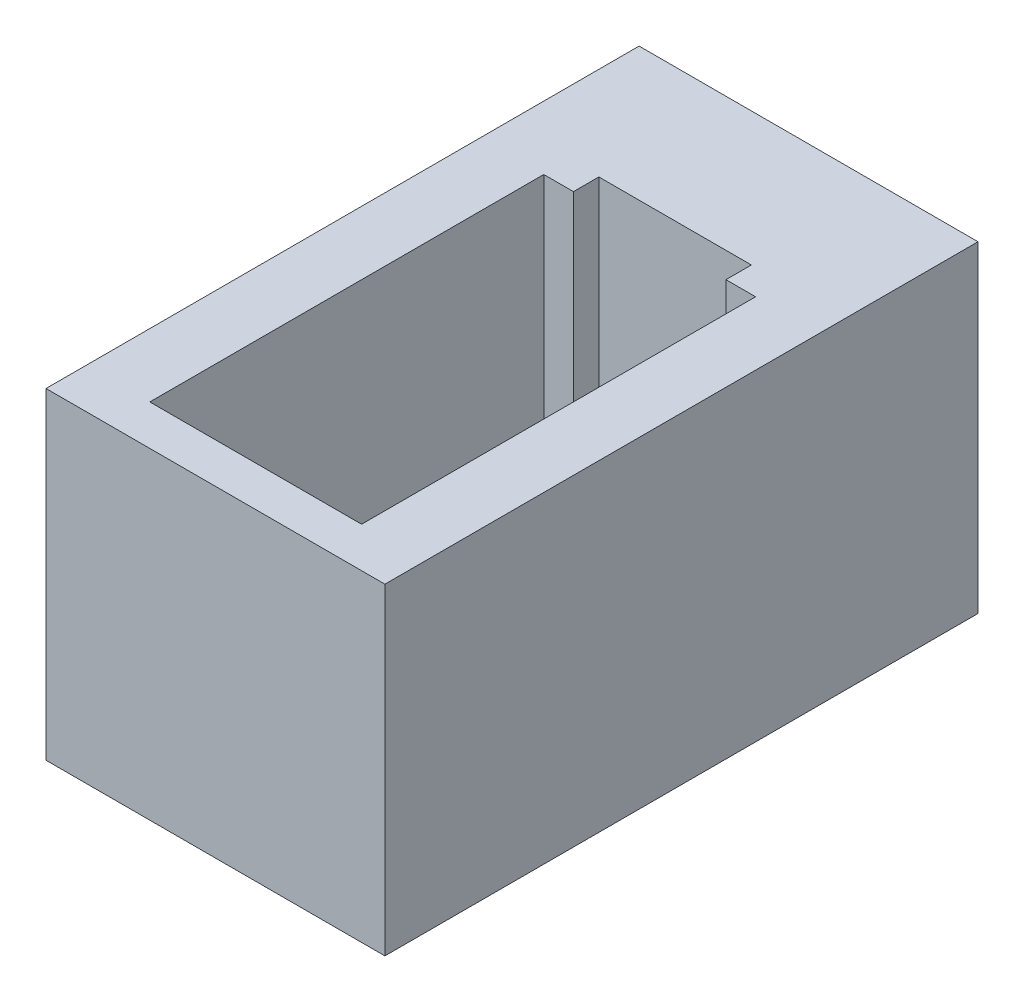
ISO-10303-21;
HEADER;
FILE_DESCRIPTION(('STEP AP214'),'2;1');
FILE_NAME('part.step','',(''),(''),'','','');
FILE_SCHEMA(('AUTOMOTIVE_DESIGN { 1 0 10303 214 1 1 1 1 }'));
ENDSEC;
DATA;
#1=APPLICATION_CONTEXT('core data for automotive mechanical design processes');
#2=APPLICATION_PROTOCOL_DEFINITION('international standard','automotive_design',2000,#1);
#3=PRODUCT_CONTEXT('',#1,'mechanical');
#4=PRODUCT('Part','Part','',(#3));
#5=PRODUCT_RELATED_PRODUCT_CATEGORY('part','',(#4));
#6=PRODUCT_DEFINITION_FORMATION('','',#4);
#7=PRODUCT_DEFINITION_CONTEXT('part definition',#1,'design');
#8=PRODUCT_DEFINITION('design','',#6,#7);
#9=PRODUCT_DEFINITION_SHAPE('','',#8);
#10=(LENGTH_UNIT() NAMED_UNIT(*) SI_UNIT(.MILLI.,.METRE.));
#11=(NAMED_UNIT(*) PLANE_ANGLE_UNIT() SI_UNIT($,.RADIAN.));
#12=(NAMED_UNIT(*) SI_UNIT($,.STERADIAN.) SOLID_ANGLE_UNIT());
#13=UNCERTAINTY_MEASURE_WITH_UNIT(LENGTH_MEASURE(1.E-05),#10,'distance_accuracy_value','');
#14=(GEOMETRIC_REPRESENTATION_CONTEXT(3) GLOBAL_UNCERTAINTY_ASSIGNED_CONTEXT((#13)) GLOBAL_UNIT_ASSIGNED_CONTEXT((#10,
#11,#12)) REPRESENTATION_CONTEXT('',''));
#15=CARTESIAN_POINT('',(0.,0.,0.));
#16=DIRECTION('',(0.,0.,1.));
#17=DIRECTION('',(1.,0.,0.));
#18=AXIS2_PLACEMENT_3D('',#15,#16,#17);
#19=CARTESIAN_POINT('',(-6.25,3.,-11.625));
#20=DIRECTION('',(0.,0.,-1.));
#21=DIRECTION('',(-1.,0.,0.));
#22=AXIS2_PLACEMENT_3D('',#19,#20,#21);
#23=PLANE('',#22);
#24=DIRECTION('',(-1.,0.,0.));
#25=VECTOR('',#24,1.);
#26=CARTESIAN_POINT('',(-6.25,19.,-11.625));
#27=LINE('',#26,#25);
#28=CARTESIAN_POINT('',(6.25,19.,-11.625));
#29=VERTEX_POINT('',#28);
#30=CARTESIAN_POINT('',(4.5,19.,-11.625));
#31=VERTEX_POINT('',#30);
#32=EDGE_CURVE('E206',#29,#31,#27,.T.);
#33=ORIENTED_EDGE('',*,*,#32,.T.);
#34=DIRECTION('',(0.,-1.,0.));
#35=VECTOR('',#34,1.);
#36=CARTESIAN_POINT('',(4.5,3.,-11.625));
#37=LINE('',#36,#35);
#38=CARTESIAN_POINT('',(4.5,3.,-11.625));
#39=VERTEX_POINT('',#38);
#40=EDGE_CURVE('E174',#31,#39,#37,.T.);
#41=ORIENTED_EDGE('',*,*,#40,.T.);
#42=DIRECTION('',(-1.,0.,0.));
#43=VECTOR('',#42,1.);
#44=CARTESIAN_POINT('',(-6.25,3.,-11.625));
#45=LINE('',#44,#43);
#46=CARTESIAN_POINT('',(6.25,3.,-11.625));
#47=VERTEX_POINT('',#46);
#48=EDGE_CURVE('E195',#47,#39,#45,.T.);
#49=ORIENTED_EDGE('',*,*,#48,.F.);
#50=DIRECTION('',(0.,1.,0.));
#51=VECTOR('',#50,1.);
#52=CARTESIAN_POINT('',(6.25,3.,-11.625));
#53=LINE('',#52,#51);
#54=EDGE_CURVE('E204',#47,#29,#53,.T.);
#55=ORIENTED_EDGE('',*,*,#54,.T.);
#56=EDGE_LOOP('',(#33,#41,#49,#55));
#57=FACE_BOUND('',#56,.T.);
#58=ADVANCED_FACE('F33',(#57),#23,.F.);
#59=CARTESIAN_POINT('',(10.,19.,-14.));
#60=DIRECTION('',(-1.,0.,0.));
#61=DIRECTION('',(0.,0.,1.));
#62=AXIS2_PLACEMENT_3D('',#59,#60,#61);
#63=PLANE('',#62);
#64=DIRECTION('',(0.,0.,-1.));
#65=VECTOR('',#64,1.);
#66=CARTESIAN_POINT('',(10.,0.,-14.));
#67=LINE('',#66,#65);
#68=CARTESIAN_POINT('',(10.,0.,14.));
#69=VERTEX_POINT('',#68);
#70=CARTESIAN_POINT('',(9.99999999999999,0.,-21.));
#71=VERTEX_POINT('',#70);
#72=EDGE_CURVE('E216',#69,#71,#67,.T.);
#73=ORIENTED_EDGE('',*,*,#72,.T.);
#74=DIRECTION('',(0.,-1.,0.));
#75=VECTOR('',#74,1.);
#76=CARTESIAN_POINT('',(9.99999999999999,19.,-21.));
#77=LINE('',#76,#75);
#78=CARTESIAN_POINT('',(9.99999999999999,19.,-21.));
#79=VERTEX_POINT('',#78);
#80=EDGE_CURVE('E177',#79,#71,#77,.T.);
#81=ORIENTED_EDGE('',*,*,#80,.F.);
#82=DIRECTION('',(0.,0.,-1.));
#83=VECTOR('',#82,1.);
#84=CARTESIAN_POINT('',(10.,19.,-14.));
#85=LINE('',#84,#83);
#86=CARTESIAN_POINT('',(10.,19.,14.));
#87=VERTEX_POINT('',#86);
#88=EDGE_CURVE('E224',#87,#79,#85,.T.);
#89=ORIENTED_EDGE('',*,*,#88,.F.);
#90=DIRECTION('',(0.,-1.,0.));
#91=VECTOR('',#90,1.);
#92=CARTESIAN_POINT('',(10.,19.,14.));
#93=LINE('',#92,#91);
#94=EDGE_CURVE('E231',#87,#69,#93,.T.);
#95=ORIENTED_EDGE('',*,*,#94,.T.);
#96=EDGE_LOOP('',(#73,#81,#89,#95));
#97=FACE_BOUND('',#96,.T.);
#98=ADVANCED_FACE('F35',(#97),#63,.F.);
#99=CARTESIAN_POINT('',(-10.,19.,-14.));
#100=DIRECTION('',(1.,0.,0.));
#101=DIRECTION('',(0.,0.,-1.));
#102=AXIS2_PLACEMENT_3D('',#99,#100,#101);
#103=PLANE('',#102);
#104=DIRECTION('',(0.,0.,1.));
#105=VECTOR('',#104,1.);
#106=CARTESIAN_POINT('',(-10.,0.,-14.));
#107=LINE('',#106,#105);
#108=CARTESIAN_POINT('',(-10.,0.,-21.));
#109=VERTEX_POINT('',#108);
#110=CARTESIAN_POINT('',(-9.99999999999999,0.,14.));
#111=VERTEX_POINT('',#110);
#112=EDGE_CURVE('E233',#109,#111,#107,.T.);
#113=ORIENTED_EDGE('',*,*,#112,.T.);
#114=DIRECTION('',(0.,-1.,0.));
#115=VECTOR('',#114,1.);
#116=CARTESIAN_POINT('',(-9.99999999999999,19.,14.));
#117=LINE('',#116,#115);
#118=CARTESIAN_POINT('',(-9.99999999999999,19.,14.));
#119=VERTEX_POINT('',#118);
#120=EDGE_CURVE('E238',#119,#111,#117,.T.);
#121=ORIENTED_EDGE('',*,*,#120,.F.);
#122=DIRECTION('',(0.,0.,1.));
#123=VECTOR('',#122,1.);
#124=CARTESIAN_POINT('',(-10.,19.,-14.));
#125=LINE('',#124,#123);
#126=CARTESIAN_POINT('',(-10.,19.,-21.));
#127=VERTEX_POINT('',#126);
#128=EDGE_CURVE('E226',#127,#119,#125,.T.);
#129=ORIENTED_EDGE('',*,*,#128,.F.);
#130=DIRECTION('',(0.,1.,0.));
#131=VECTOR('',#130,1.);
#132=CARTESIAN_POINT('',(-10.,19.,-21.));
#133=LINE('',#132,#131);
#134=EDGE_CURVE('E183',#109,#127,#133,.T.);
#135=ORIENTED_EDGE('',*,*,#134,.F.);
#136=EDGE_LOOP('',(#113,#121,#129,#135));
#137=FACE_BOUND('',#136,.T.);
#138=ADVANCED_FACE('F277',(#137),#103,.F.);
#139=CARTESIAN_POINT('',(-9.99999999999999,19.,14.));
#140=DIRECTION('',(0.,0.,-1.));
#141=DIRECTION('',(-1.,0.,0.));
#142=AXIS2_PLACEMENT_3D('',#139,#140,#141);
#143=PLANE('',#142);
#144=DIRECTION('',(1.,0.,0.));
#145=VECTOR('',#144,1.);
#146=CARTESIAN_POINT('',(-9.99999999999999,0.,14.));
#147=LINE('',#146,#145);
#148=EDGE_CURVE('E227',#111,#69,#147,.T.);
#149=ORIENTED_EDGE('',*,*,#148,.T.);
#150=ORIENTED_EDGE('',*,*,#94,.F.);
#151=DIRECTION('',(1.,0.,0.));
#152=VECTOR('',#151,1.);
#153=CARTESIAN_POINT('',(-9.99999999999999,19.,14.));
#154=LINE('',#153,#152);
#155=EDGE_CURVE('E229',#119,#87,#154,.T.);
#156=ORIENTED_EDGE('',*,*,#155,.F.);
#157=ORIENTED_EDGE('',*,*,#120,.T.);
#158=EDGE_LOOP('',(#149,#150,#156,#157));
#159=FACE_BOUND('',#158,.T.);
#160=ADVANCED_FACE('F274',(#159),#143,.F.);
#161=CARTESIAN_POINT('',(0.,19.,0.));
#162=DIRECTION('',(0.,1.,0.));
#163=DIRECTION('',(0.,0.,1.));
#164=AXIS2_PLACEMENT_3D('',#161,#162,#163);
#165=PLANE('',#164);
#166=DIRECTION('',(0.,0.,1.));
#167=VECTOR('',#166,1.);
#168=CARTESIAN_POINT('',(4.5,19.,-13.125));
#169=LINE('',#168,#167);
#170=CARTESIAN_POINT('',(4.5,19.,-13.125));
#171=VERTEX_POINT('',#170);
#172=EDGE_CURVE('E159',#171,#31,#169,.T.);
#173=ORIENTED_EDGE('',*,*,#172,.T.);
#174=ORIENTED_EDGE('',*,*,#32,.F.);
#175=DIRECTION('',(0.,0.,-1.));
#176=VECTOR('',#175,1.);
#177=CARTESIAN_POINT('',(6.25,19.,-11.625));
#178=LINE('',#177,#176);
#179=CARTESIAN_POINT('',(6.25,19.,11.625));
#180=VERTEX_POINT('',#179);
#181=EDGE_CURVE('E189',#180,#29,#178,.T.);
#182=ORIENTED_EDGE('',*,*,#181,.F.);
#183=DIRECTION('',(1.,0.,0.));
#184=VECTOR('',#183,1.);
#185=CARTESIAN_POINT('',(-6.25,19.,11.625));
#186=LINE('',#185,#184);
#187=CARTESIAN_POINT('',(-6.25,19.,11.625));
#188=VERTEX_POINT('',#187);
#189=EDGE_CURVE('E194',#188,#180,#186,.T.);
#190=ORIENTED_EDGE('',*,*,#189,.F.);
#191=DIRECTION('',(0.,0.,1.));
#192=VECTOR('',#191,1.);
#193=CARTESIAN_POINT('',(-6.25,19.,-11.625));
#194=LINE('',#193,#192);
#195=CARTESIAN_POINT('',(-6.25,19.,-11.625));
#196=VERTEX_POINT('',#195);
#197=EDGE_CURVE('E209',#196,#188,#194,.T.);
#198=ORIENTED_EDGE('',*,*,#197,.F.);
#199=CARTESIAN_POINT('',(-4.5,19.,-11.625));
#200=VERTEX_POINT('',#199);
#201=EDGE_CURVE('E158',#200,#196,#27,.T.);
#202=ORIENTED_EDGE('',*,*,#201,.F.);
#203=DIRECTION('',(0.,0.,-1.));
#204=VECTOR('',#203,1.);
#205=CARTESIAN_POINT('',(-4.5,19.,-13.125));
#206=LINE('',#205,#204);
#207=CARTESIAN_POINT('',(-4.5,19.,-13.125));
#208=VERTEX_POINT('',#207);
#209=EDGE_CURVE('E137',#200,#208,#206,.T.);
#210=ORIENTED_EDGE('',*,*,#209,.T.);
#211=DIRECTION('',(1.,0.,0.));
#212=VECTOR('',#211,1.);
#213=CARTESIAN_POINT('',(4.5,19.,-13.125));
#214=LINE('',#213,#212);
#215=EDGE_CURVE('E147',#208,#171,#214,.T.);
#216=ORIENTED_EDGE('',*,*,#215,.T.);
#217=EDGE_LOOP('',(#173,#174,#182,#190,#198,#202,#210,#216));
#218=FACE_BOUND('',#217,.T.);
#219=ORIENTED_EDGE('',*,*,#88,.T.);
#220=DIRECTION('',(1.,0.,0.));
#221=VECTOR('',#220,1.);
#222=CARTESIAN_POINT('',(9.99999999999999,19.,-21.));
#223=LINE('',#222,#221);
#224=EDGE_CURVE('E186',#127,#79,#223,.T.);
#225=ORIENTED_EDGE('',*,*,#224,.F.);
#226=ORIENTED_EDGE('',*,*,#128,.T.);
#227=ORIENTED_EDGE('',*,*,#155,.T.);
#228=EDGE_LOOP('',(#219,#225,#226,#227));
#229=FACE_BOUND('',#228,.T.);
#230=ADVANCED_FACE('F155',(#218,#229),#165,.T.);
#231=CARTESIAN_POINT('',(0.,0.,0.));
#232=DIRECTION('',(0.,1.,0.));
#233=DIRECTION('',(0.,0.,1.));
#234=AXIS2_PLACEMENT_3D('',#231,#232,#233);
#235=PLANE('',#234);
#236=DIRECTION('',(-1.,0.,0.));
#237=VECTOR('',#236,1.);
#238=CARTESIAN_POINT('',(4.5,0.,-8.125));
#239=LINE('',#238,#237);
#240=CARTESIAN_POINT('',(4.5,0.,-8.125));
#241=VERTEX_POINT('',#240);
#242=CARTESIAN_POINT('',(-4.5,0.,-8.125));
#243=VERTEX_POINT('',#242);
#244=EDGE_CURVE('E165',#241,#243,#239,.T.);
#245=ORIENTED_EDGE('',*,*,#244,.F.);
#246=DIRECTION('',(0.,0.,1.));
#247=VECTOR('',#246,1.);
#248=CARTESIAN_POINT('',(4.5,0.,-13.125));
#249=LINE('',#248,#247);
#250=CARTESIAN_POINT('',(4.5,0.,-13.125));
#251=VERTEX_POINT('',#250);
#252=EDGE_CURVE('E48',#251,#241,#249,.T.);
#253=ORIENTED_EDGE('',*,*,#252,.F.);
#254=DIRECTION('',(1.,0.,0.));
#255=VECTOR('',#254,1.);
#256=CARTESIAN_POINT('',(4.5,0.,-13.125));
#257=LINE('',#256,#255);
#258=CARTESIAN_POINT('',(-4.5,0.,-13.125));
#259=VERTEX_POINT('',#258);
#260=EDGE_CURVE('E161',#259,#251,#257,.T.);
#261=ORIENTED_EDGE('',*,*,#260,.F.);
#262=DIRECTION('',(0.,0.,-1.));
#263=VECTOR('',#262,1.);
#264=CARTESIAN_POINT('',(-4.5,0.,-13.125));
#265=LINE('',#264,#263);
#266=EDGE_CURVE('E140',#243,#259,#265,.T.);
#267=ORIENTED_EDGE('',*,*,#266,.F.);
#268=EDGE_LOOP('',(#245,#253,#261,#267));
#269=FACE_BOUND('',#268,.T.);
#270=ORIENTED_EDGE('',*,*,#72,.F.);
#271=ORIENTED_EDGE('',*,*,#148,.F.);
#272=ORIENTED_EDGE('',*,*,#112,.F.);
#273=DIRECTION('',(-1.,0.,0.));
#274=VECTOR('',#273,1.);
#275=CARTESIAN_POINT('',(9.99999999999999,0.,-21.));
#276=LINE('',#275,#274);
#277=EDGE_CURVE('E180',#71,#109,#276,.T.);
#278=ORIENTED_EDGE('',*,*,#277,.F.);
#279=EDGE_LOOP('',(#270,#271,#272,#278));
#280=FACE_BOUND('',#279,.T.);
#281=ADVANCED_FACE('F261',(#269,#280),#235,.F.);
#282=CARTESIAN_POINT('',(6.25,3.,-11.625));
#283=DIRECTION('',(1.,0.,0.));
#284=DIRECTION('',(0.,0.,-1.));
#285=AXIS2_PLACEMENT_3D('',#282,#283,#284);
#286=PLANE('',#285);
#287=ORIENTED_EDGE('',*,*,#181,.T.);
#288=ORIENTED_EDGE('',*,*,#54,.F.);
#289=DIRECTION('',(0.,0.,-1.));
#290=VECTOR('',#289,1.);
#291=CARTESIAN_POINT('',(6.25,3.,-11.625));
#292=LINE('',#291,#290);
#293=CARTESIAN_POINT('',(6.25,3.,11.625));
#294=VERTEX_POINT('',#293);
#295=EDGE_CURVE('E190',#294,#47,#292,.T.);
#296=ORIENTED_EDGE('',*,*,#295,.F.);
#297=DIRECTION('',(0.,1.,0.));
#298=VECTOR('',#297,1.);
#299=CARTESIAN_POINT('',(6.25,3.,11.625));
#300=LINE('',#299,#298);
#301=EDGE_CURVE('E214',#294,#180,#300,.T.);
#302=ORIENTED_EDGE('',*,*,#301,.T.);
#303=EDGE_LOOP('',(#287,#288,#296,#302));
#304=FACE_BOUND('',#303,.T.);
#305=ADVANCED_FACE('F257',(#304),#286,.F.);
#306=CARTESIAN_POINT('',(-6.25,3.,11.625));
#307=DIRECTION('',(0.,0.,1.));
#308=DIRECTION('',(1.,0.,0.));
#309=AXIS2_PLACEMENT_3D('',#306,#307,#308);
#310=PLANE('',#309);
#311=ORIENTED_EDGE('',*,*,#189,.T.);
#312=ORIENTED_EDGE('',*,*,#301,.F.);
#313=DIRECTION('',(1.,0.,0.));
#314=VECTOR('',#313,1.);
#315=CARTESIAN_POINT('',(-6.25,3.,11.625));
#316=LINE('',#315,#314);
#317=CARTESIAN_POINT('',(-6.25,3.,11.625));
#318=VERTEX_POINT('',#317);
#319=EDGE_CURVE('E201',#318,#294,#316,.T.);
#320=ORIENTED_EDGE('',*,*,#319,.F.);
#321=DIRECTION('',(0.,1.,0.));
#322=VECTOR('',#321,1.);
#323=CARTESIAN_POINT('',(-6.25,3.,11.625));
#324=LINE('',#323,#322);
#325=EDGE_CURVE('E217',#318,#188,#324,.T.);
#326=ORIENTED_EDGE('',*,*,#325,.T.);
#327=EDGE_LOOP('',(#311,#312,#320,#326));
#328=FACE_BOUND('',#327,.T.);
#329=ADVANCED_FACE('F304',(#328),#310,.F.);
#330=CARTESIAN_POINT('',(-6.25,3.,-11.625));
#331=DIRECTION('',(-1.,0.,0.));
#332=DIRECTION('',(0.,0.,1.));
#333=AXIS2_PLACEMENT_3D('',#330,#331,#332);
#334=PLANE('',#333);
#335=ORIENTED_EDGE('',*,*,#197,.T.);
#336=ORIENTED_EDGE('',*,*,#325,.F.);
#337=DIRECTION('',(0.,0.,1.));
#338=VECTOR('',#337,1.);
#339=CARTESIAN_POINT('',(-6.25,3.,-11.625));
#340=LINE('',#339,#338);
#341=CARTESIAN_POINT('',(-6.25,3.,-11.625));
#342=VERTEX_POINT('',#341);
#343=EDGE_CURVE('E198',#342,#318,#340,.T.);
#344=ORIENTED_EDGE('',*,*,#343,.F.);
#345=DIRECTION('',(0.,1.,0.));
#346=VECTOR('',#345,1.);
#347=CARTESIAN_POINT('',(-6.25,3.,-11.625));
#348=LINE('',#347,#346);
#349=EDGE_CURVE('E219',#342,#196,#348,.T.);
#350=ORIENTED_EDGE('',*,*,#349,.T.);
#351=EDGE_LOOP('',(#335,#336,#344,#350));
#352=FACE_BOUND('',#351,.T.);
#353=ADVANCED_FACE('F297',(#352),#334,.F.);
#354=CARTESIAN_POINT('',(-4.5,3.,-11.625));
#355=VERTEX_POINT('',#354);
#356=EDGE_CURVE('E193',#355,#342,#45,.T.);
#357=ORIENTED_EDGE('',*,*,#356,.F.);
#358=DIRECTION('',(0.,1.,0.));
#359=VECTOR('',#358,1.);
#360=CARTESIAN_POINT('',(-4.5,3.,-11.625));
#361=LINE('',#360,#359);
#362=EDGE_CURVE('E169',#355,#200,#361,.T.);
#363=ORIENTED_EDGE('',*,*,#362,.T.);
#364=ORIENTED_EDGE('',*,*,#201,.T.);
#365=ORIENTED_EDGE('',*,*,#349,.F.);
#366=EDGE_LOOP('',(#357,#363,#364,#365));
#367=FACE_BOUND('',#366,.T.);
#368=ADVANCED_FACE('F291',(#367),#23,.F.);
#369=CARTESIAN_POINT('',(0.,3.,0.));
#370=DIRECTION('',(0.,1.,0.));
#371=DIRECTION('',(0.,0.,1.));
#372=AXIS2_PLACEMENT_3D('',#369,#370,#371);
#373=PLANE('',#372);
#374=DIRECTION('',(0.,0.,-1.));
#375=VECTOR('',#374,1.);
#376=CARTESIAN_POINT('',(4.5,3.,0.));
#377=LINE('',#376,#375);
#378=CARTESIAN_POINT('',(4.5,3.,-8.125));
#379=VERTEX_POINT('',#378);
#380=EDGE_CURVE('E11',#379,#39,#377,.T.);
#381=ORIENTED_EDGE('',*,*,#380,.F.);
#382=DIRECTION('',(1.,0.,0.));
#383=VECTOR('',#382,1.);
#384=CARTESIAN_POINT('',(0.,3.,-8.125));
#385=LINE('',#384,#383);
#386=CARTESIAN_POINT('',(-4.5,3.,-8.125));
#387=VERTEX_POINT('',#386);
#388=EDGE_CURVE('E241',#387,#379,#385,.T.);
#389=ORIENTED_EDGE('',*,*,#388,.F.);
#390=DIRECTION('',(0.,0.,1.));
#391=VECTOR('',#390,1.);
#392=CARTESIAN_POINT('',(-4.5,3.,0.));
#393=LINE('',#392,#391);
#394=EDGE_CURVE('E41',#355,#387,#393,.T.);
#395=ORIENTED_EDGE('',*,*,#394,.F.);
#396=ORIENTED_EDGE('',*,*,#356,.T.);
#397=ORIENTED_EDGE('',*,*,#343,.T.);
#398=ORIENTED_EDGE('',*,*,#319,.T.);
#399=ORIENTED_EDGE('',*,*,#295,.T.);
#400=ORIENTED_EDGE('',*,*,#48,.T.);
#401=EDGE_LOOP('',(#381,#389,#395,#396,#397,#398,#399,#400));
#402=FACE_BOUND('',#401,.T.);
#403=ADVANCED_FACE('F247',(#402),#373,.T.);
#404=CARTESIAN_POINT('',(0.,0.,-21.));
#405=DIRECTION('',(0.,0.,-1.));
#406=DIRECTION('',(-1.,0.,0.));
#407=AXIS2_PLACEMENT_3D('',#404,#405,#406);
#408=PLANE('',#407);
#409=ORIENTED_EDGE('',*,*,#80,.T.);
#410=ORIENTED_EDGE('',*,*,#277,.T.);
#411=ORIENTED_EDGE('',*,*,#134,.T.);
#412=ORIENTED_EDGE('',*,*,#224,.T.);
#413=EDGE_LOOP('',(#409,#410,#411,#412));
#414=FACE_BOUND('',#413,.T.);
#415=ADVANCED_FACE('F280',(#414),#408,.T.);
#416=CARTESIAN_POINT('',(4.5,19.,-13.125));
#417=DIRECTION('',(1.,0.,0.));
#418=DIRECTION('',(0.,0.,-1.));
#419=AXIS2_PLACEMENT_3D('',#416,#417,#418);
#420=PLANE('',#419);
#421=ORIENTED_EDGE('',*,*,#172,.F.);
#422=DIRECTION('',(0.,-1.,0.));
#423=VECTOR('',#422,1.);
#424=CARTESIAN_POINT('',(4.5,19.,-13.125));
#425=LINE('',#424,#423);
#426=EDGE_CURVE('E144',#171,#251,#425,.T.);
#427=ORIENTED_EDGE('',*,*,#426,.T.);
#428=ORIENTED_EDGE('',*,*,#252,.T.);
#429=DIRECTION('',(0.,-1.,0.));
#430=VECTOR('',#429,1.);
#431=CARTESIAN_POINT('',(4.5,19.,-8.125));
#432=LINE('',#431,#430);
#433=EDGE_CURVE('E152',#379,#241,#432,.T.);
#434=ORIENTED_EDGE('',*,*,#433,.F.);
#435=ORIENTED_EDGE('',*,*,#380,.T.);
#436=ORIENTED_EDGE('',*,*,#40,.F.);
#437=EDGE_LOOP('',(#421,#427,#428,#434,#435,#436));
#438=FACE_BOUND('',#437,.T.);
#439=ADVANCED_FACE('F250',(#438),#420,.F.);
#440=CARTESIAN_POINT('',(-4.5,19.,-13.125));
#441=DIRECTION('',(-1.,0.,0.));
#442=DIRECTION('',(0.,0.,1.));
#443=AXIS2_PLACEMENT_3D('',#440,#441,#442);
#444=PLANE('',#443);
#445=ORIENTED_EDGE('',*,*,#394,.T.);
#446=DIRECTION('',(0.,-1.,0.));
#447=VECTOR('',#446,1.);
#448=CARTESIAN_POINT('',(-4.5,19.,-8.125));
#449=LINE('',#448,#447);
#450=EDGE_CURVE('E56',#387,#243,#449,.T.);
#451=ORIENTED_EDGE('',*,*,#450,.T.);
#452=ORIENTED_EDGE('',*,*,#266,.T.);
#453=DIRECTION('',(0.,-1.,0.));
#454=VECTOR('',#453,1.);
#455=CARTESIAN_POINT('',(-4.5,19.,-13.125));
#456=LINE('',#455,#454);
#457=EDGE_CURVE('E133',#208,#259,#456,.T.);
#458=ORIENTED_EDGE('',*,*,#457,.F.);
#459=ORIENTED_EDGE('',*,*,#209,.F.);
#460=ORIENTED_EDGE('',*,*,#362,.F.);
#461=EDGE_LOOP('',(#445,#451,#452,#458,#459,#460));
#462=FACE_BOUND('',#461,.T.);
#463=ADVANCED_FACE('F135',(#462),#444,.F.);
#464=CARTESIAN_POINT('',(4.5,19.,-13.125));
#465=DIRECTION('',(0.,0.,-1.));
#466=DIRECTION('',(-1.,0.,0.));
#467=AXIS2_PLACEMENT_3D('',#464,#465,#466);
#468=PLANE('',#467);
#469=ORIENTED_EDGE('',*,*,#260,.T.);
#470=ORIENTED_EDGE('',*,*,#426,.F.);
#471=ORIENTED_EDGE('',*,*,#215,.F.);
#472=ORIENTED_EDGE('',*,*,#457,.T.);
#473=EDGE_LOOP('',(#469,#470,#471,#472));
#474=FACE_BOUND('',#473,.T.);
#475=ADVANCED_FACE('F148',(#474),#468,.F.);
#476=CARTESIAN_POINT('',(4.5,19.,-8.125));
#477=DIRECTION('',(0.,0.,1.));
#478=DIRECTION('',(1.,0.,0.));
#479=AXIS2_PLACEMENT_3D('',#476,#477,#478);
#480=PLANE('',#479);
#481=ORIENTED_EDGE('',*,*,#388,.T.);
#482=ORIENTED_EDGE('',*,*,#433,.T.);
#483=ORIENTED_EDGE('',*,*,#244,.T.);
#484=ORIENTED_EDGE('',*,*,#450,.F.);
#485=EDGE_LOOP('',(#481,#482,#483,#484));
#486=FACE_BOUND('',#485,.T.);
#487=ADVANCED_FACE('F248',(#486),#480,.F.);
#488=CLOSED_SHELL('',(#58,#98,#138,#160,#230,#281,#305,#329,#353,#368,#403,#415,#439,#463,#475,#487));
#489=MANIFOLD_SOLID_BREP('B2',#488);
#490=ADVANCED_BREP_SHAPE_REPRESENTATION('',(#18,#489),#14);
#491=SHAPE_DEFINITION_REPRESENTATION(#9,#490);
ENDSEC;
END-ISO-10303-21;
